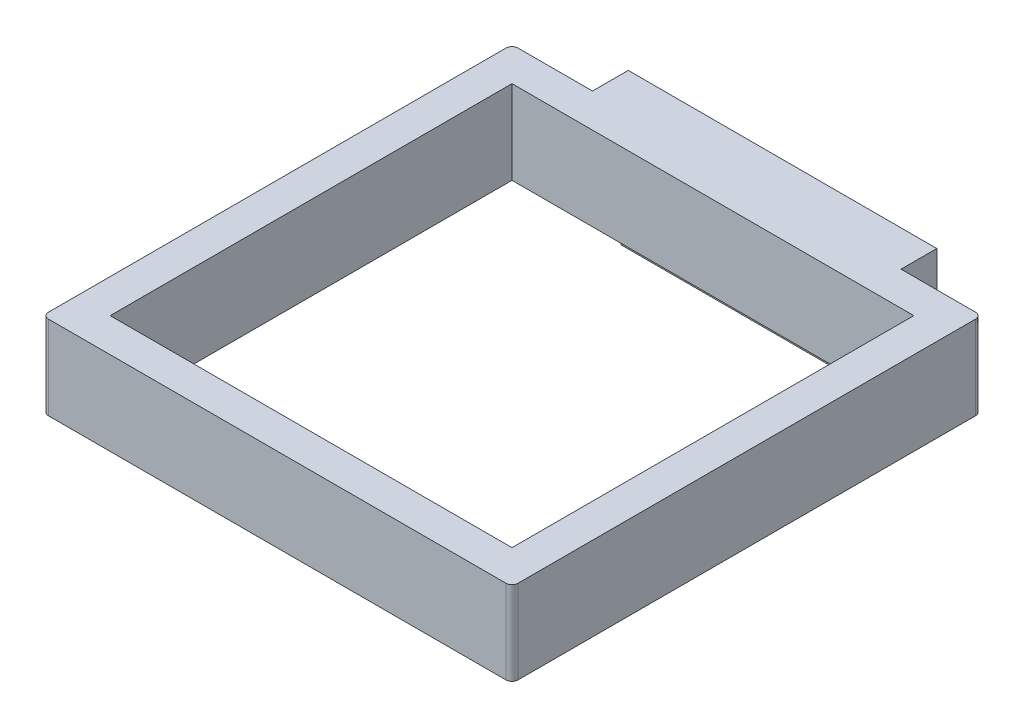
ISO-10303-21;
HEADER;
FILE_DESCRIPTION(('STEP AP214'),'2;1');
FILE_NAME('part.step','',(''),(''),'','','');
FILE_SCHEMA(('AUTOMOTIVE_DESIGN { 1 0 10303 214 1 1 1 1 }'));
ENDSEC;
DATA;
#1=APPLICATION_CONTEXT('core data for automotive mechanical design processes');
#2=APPLICATION_PROTOCOL_DEFINITION('international standard','automotive_design',2000,#1);
#3=PRODUCT_CONTEXT('',#1,'mechanical');
#4=PRODUCT('Part','Part','',(#3));
#5=PRODUCT_RELATED_PRODUCT_CATEGORY('part','',(#4));
#6=PRODUCT_DEFINITION_FORMATION('','',#4);
#7=PRODUCT_DEFINITION_CONTEXT('part definition',#1,'design');
#8=PRODUCT_DEFINITION('design','',#6,#7);
#9=PRODUCT_DEFINITION_SHAPE('','',#8);
#10=(LENGTH_UNIT() NAMED_UNIT(*) SI_UNIT(.MILLI.,.METRE.));
#11=(NAMED_UNIT(*) PLANE_ANGLE_UNIT() SI_UNIT($,.RADIAN.));
#12=(NAMED_UNIT(*) SI_UNIT($,.STERADIAN.) SOLID_ANGLE_UNIT());
#13=UNCERTAINTY_MEASURE_WITH_UNIT(LENGTH_MEASURE(1.E-05),#10,'distance_accuracy_value','');
#14=(GEOMETRIC_REPRESENTATION_CONTEXT(3) GLOBAL_UNCERTAINTY_ASSIGNED_CONTEXT((#13)) GLOBAL_UNIT_ASSIGNED_CONTEXT((#10,
#11,#12)) REPRESENTATION_CONTEXT('',''));
#15=CARTESIAN_POINT('',(0.,0.,0.));
#16=DIRECTION('',(0.,0.,1.));
#17=DIRECTION('',(1.,0.,0.));
#18=AXIS2_PLACEMENT_3D('',#15,#16,#17);
#19=CARTESIAN_POINT('',(53.9098345026567,0.,-17.1473638768007));
#20=DIRECTION('',(0.,-1.,0.));
#21=DIRECTION('',(0.,0.,-1.));
#22=AXIS2_PLACEMENT_3D('',#19,#20,#21);
#23=PLANE('',#22);
#24=DIRECTION('',(0.,0.,1.));
#25=VECTOR('',#24,1.);
#26=CARTESIAN_POINT('',(-19.3651654973433,0.,0.));
#27=LINE('',#26,#25);
#28=CARTESIAN_POINT('',(-19.3651654973433,0.,-13.6723638768007));
#29=VERTEX_POINT('',#28);
#30=CARTESIAN_POINT('',(-19.3651654973433,0.,56.1276361231993));
#31=VERTEX_POINT('',#30);
#32=EDGE_CURVE('E300',#29,#31,#27,.T.);
#33=ORIENTED_EDGE('',*,*,#32,.T.);
#34=DIRECTION('',(1.,0.,0.));
#35=VECTOR('',#34,1.);
#36=CARTESIAN_POINT('',(0.,0.,56.1276361231993));
#37=LINE('',#36,#35);
#38=CARTESIAN_POINT('',(50.4348345026567,0.,56.1276361231993));
#39=VERTEX_POINT('',#38);
#40=EDGE_CURVE('E979',#31,#39,#37,.T.);
#41=ORIENTED_EDGE('',*,*,#40,.T.);
#42=DIRECTION('',(0.,0.,-1.));
#43=VECTOR('',#42,1.);
#44=CARTESIAN_POINT('',(50.4348345026567,0.,0.));
#45=LINE('',#44,#43);
#46=CARTESIAN_POINT('',(50.4348345026567,0.,-13.6723638768007));
#47=VERTEX_POINT('',#46);
#48=EDGE_CURVE('E977',#39,#47,#45,.T.);
#49=ORIENTED_EDGE('',*,*,#48,.T.);
#50=DIRECTION('',(-1.,0.,0.));
#51=VECTOR('',#50,1.);
#52=CARTESIAN_POINT('',(0.,0.,-13.6723638768007));
#53=LINE('',#52,#51);
#54=EDGE_CURVE('E107',#47,#29,#53,.T.);
#55=ORIENTED_EDGE('',*,*,#54,.T.);
#56=EDGE_LOOP('',(#33,#41,#49,#55));
#57=FACE_BOUND('',#56,.T.);
#58=DIRECTION('',(0.,0.,-1.));
#59=VECTOR('',#58,1.);
#60=CARTESIAN_POINT('',(40.2098345026567,0.,0.));
#61=LINE('',#60,#59);
#62=CARTESIAN_POINT('',(40.2098345026567,0.,-16.9473638768007));
#63=VERTEX_POINT('',#62);
#64=CARTESIAN_POINT('',(40.2098345026567,0.,-22.9473638768007));
#65=VERTEX_POINT('',#64);
#66=EDGE_CURVE('E400',#63,#65,#61,.T.);
#67=ORIENTED_EDGE('',*,*,#66,.F.);
#68=DIRECTION('',(-1.,0.,0.));
#69=VECTOR('',#68,1.);
#70=CARTESIAN_POINT('',(0.,0.,-16.9473638768007));
#71=LINE('',#70,#69);
#72=CARTESIAN_POINT('',(53.7098345026567,0.,-16.9473638768007));
#73=VERTEX_POINT('',#72);
#74=EDGE_CURVE('E397',#73,#63,#71,.T.);
#75=ORIENTED_EDGE('',*,*,#74,.F.);
#76=DIRECTION('',(0.,0.,-1.));
#77=VECTOR('',#76,1.);
#78=CARTESIAN_POINT('',(53.7098345026567,0.,0.));
#79=LINE('',#78,#77);
#80=CARTESIAN_POINT('',(53.7098345026567,0.,59.4026361231993));
#81=VERTEX_POINT('',#80);
#82=EDGE_CURVE('E358',#81,#73,#79,.T.);
#83=ORIENTED_EDGE('',*,*,#82,.F.);
#84=DIRECTION('',(1.,0.,0.));
#85=VECTOR('',#84,1.);
#86=CARTESIAN_POINT('',(0.,0.,59.4026361231993));
#87=LINE('',#86,#85);
#88=CARTESIAN_POINT('',(-22.6401654973433,0.,59.4026361231993));
#89=VERTEX_POINT('',#88);
#90=EDGE_CURVE('E411',#89,#81,#87,.T.);
#91=ORIENTED_EDGE('',*,*,#90,.F.);
#92=DIRECTION('',(0.,0.,1.));
#93=VECTOR('',#92,1.);
#94=CARTESIAN_POINT('',(-22.6401654973433,0.,0.));
#95=LINE('',#94,#93);
#96=CARTESIAN_POINT('',(-22.6401654973433,0.,-16.9473638768007));
#97=VERTEX_POINT('',#96);
#98=EDGE_CURVE('E409',#97,#89,#95,.T.);
#99=ORIENTED_EDGE('',*,*,#98,.F.);
#100=DIRECTION('',(-1.,0.,0.));
#101=VECTOR('',#100,1.);
#102=CARTESIAN_POINT('',(0.,0.,-16.9473638768007));
#103=LINE('',#102,#101);
#104=CARTESIAN_POINT('',(-9.14016549734332,0.,-16.9473638768007));
#105=VERTEX_POINT('',#104);
#106=EDGE_CURVE('E407',#105,#97,#103,.T.);
#107=ORIENTED_EDGE('',*,*,#106,.F.);
#108=DIRECTION('',(0.,0.,1.));
#109=VECTOR('',#108,1.);
#110=CARTESIAN_POINT('',(-9.14016549734332,0.,0.));
#111=LINE('',#110,#109);
#112=CARTESIAN_POINT('',(-9.14016549734332,0.,-22.9473638768007));
#113=VERTEX_POINT('',#112);
#114=EDGE_CURVE('E405',#113,#105,#111,.T.);
#115=ORIENTED_EDGE('',*,*,#114,.F.);
#116=DIRECTION('',(-1.,0.,0.));
#117=VECTOR('',#116,1.);
#118=CARTESIAN_POINT('',(0.,0.,-22.9473638768007));
#119=LINE('',#118,#117);
#120=EDGE_CURVE('E403',#65,#113,#119,.T.);
#121=ORIENTED_EDGE('',*,*,#120,.F.);
#122=EDGE_LOOP('',(#67,#75,#83,#91,#99,#107,#115,#121));
#123=FACE_BOUND('',#122,.T.);
#124=ADVANCED_FACE('F82',(#57,#123),#23,.T.);
#125=CARTESIAN_POINT('',(53.9098345026567,1.2,-17.1473638768007));
#126=DIRECTION('',(0.,-1.,0.));
#127=DIRECTION('',(0.,0.,-1.));
#128=AXIS2_PLACEMENT_3D('',#125,#126,#127);
#129=PLANE('',#128);
#130=DIRECTION('',(0.,0.,1.));
#131=VECTOR('',#130,1.);
#132=CARTESIAN_POINT('',(-10.3401654973433,1.2,-18.1473638768007));
#133=LINE('',#132,#131);
#134=CARTESIAN_POINT('',(-10.3401654973433,1.2,-24.1473638768007));
#135=VERTEX_POINT('',#134);
#136=CARTESIAN_POINT('',(-10.3401654973433,1.2,-18.1473638768007));
#137=VERTEX_POINT('',#136);
#138=EDGE_CURVE('E445',#135,#137,#133,.T.);
#139=ORIENTED_EDGE('',*,*,#138,.T.);
#140=DIRECTION('',(-1.,0.,0.));
#141=VECTOR('',#140,1.);
#142=CARTESIAN_POINT('',(-22.8401654973433,1.2,-18.1473638768007));
#143=LINE('',#142,#141);
#144=CARTESIAN_POINT('',(-22.8401654973433,1.2,-18.1473638768007));
#145=VERTEX_POINT('',#144);
#146=EDGE_CURVE('E448',#137,#145,#143,.T.);
#147=ORIENTED_EDGE('',*,*,#146,.T.);
#148=CARTESIAN_POINT('',(-22.8401654973433,1.2,-17.1473638768007));
#149=DIRECTION('',(0.,1.,0.));
#150=DIRECTION('',(0.,0.,1.));
#151=AXIS2_PLACEMENT_3D('',#148,#149,#150);
#152=CIRCLE('',#151,1.);
#153=CARTESIAN_POINT('',(-23.8401654973433,1.2,-17.1473638768007));
#154=VERTEX_POINT('',#153);
#155=EDGE_CURVE('E450',#145,#154,#152,.T.);
#156=ORIENTED_EDGE('',*,*,#155,.T.);
#157=DIRECTION('',(0.,0.,1.));
#158=VECTOR('',#157,1.);
#159=CARTESIAN_POINT('',(-23.8401654973433,1.2,-17.1473638768007));
#160=LINE('',#159,#158);
#161=CARTESIAN_POINT('',(-23.8401654973433,1.2,59.6026361231993));
#162=VERTEX_POINT('',#161);
#163=EDGE_CURVE('E452',#154,#162,#160,.T.);
#164=ORIENTED_EDGE('',*,*,#163,.T.);
#165=CARTESIAN_POINT('',(-22.8401654973433,1.2,59.6026361231993));
#166=DIRECTION('',(0.,1.,0.));
#167=DIRECTION('',(0.,0.,-1.));
#168=AXIS2_PLACEMENT_3D('',#165,#166,#167);
#169=CIRCLE('',#168,1.);
#170=CARTESIAN_POINT('',(-22.8401654973433,1.2,60.6026361231993));
#171=VERTEX_POINT('',#170);
#172=EDGE_CURVE('E454',#162,#171,#169,.T.);
#173=ORIENTED_EDGE('',*,*,#172,.T.);
#174=DIRECTION('',(1.,0.,0.));
#175=VECTOR('',#174,1.);
#176=CARTESIAN_POINT('',(-22.8401654973433,1.2,60.6026361231993));
#177=LINE('',#176,#175);
#178=CARTESIAN_POINT('',(53.9098345026567,1.2,60.6026361231993));
#179=VERTEX_POINT('',#178);
#180=EDGE_CURVE('E456',#171,#179,#177,.T.);
#181=ORIENTED_EDGE('',*,*,#180,.T.);
#182=CARTESIAN_POINT('',(53.9098345026567,1.2,59.6026361231993));
#183=DIRECTION('',(0.,1.,0.));
#184=DIRECTION('',(0.,0.,-1.));
#185=AXIS2_PLACEMENT_3D('',#182,#183,#184);
#186=CIRCLE('',#185,1.);
#187=CARTESIAN_POINT('',(54.9098345026567,1.2,59.6026361231993));
#188=VERTEX_POINT('',#187);
#189=EDGE_CURVE('E458',#179,#188,#186,.T.);
#190=ORIENTED_EDGE('',*,*,#189,.T.);
#191=DIRECTION('',(0.,0.,-1.));
#192=VECTOR('',#191,1.);
#193=CARTESIAN_POINT('',(54.9098345026567,1.2,-17.1473638768007));
#194=LINE('',#193,#192);
#195=CARTESIAN_POINT('',(54.9098345026567,1.2,-17.1473638768007));
#196=VERTEX_POINT('',#195);
#197=EDGE_CURVE('E460',#188,#196,#194,.T.);
#198=ORIENTED_EDGE('',*,*,#197,.T.);
#199=CARTESIAN_POINT('',(53.9098345026567,1.2,-17.1473638768007));
#200=DIRECTION('',(0.,1.,0.));
#201=DIRECTION('',(0.,0.,-1.));
#202=AXIS2_PLACEMENT_3D('',#199,#200,#201);
#203=CIRCLE('',#202,1.);
#204=CARTESIAN_POINT('',(53.9098345026567,1.2,-18.1473638768007));
#205=VERTEX_POINT('',#204);
#206=EDGE_CURVE('E462',#196,#205,#203,.T.);
#207=ORIENTED_EDGE('',*,*,#206,.T.);
#208=DIRECTION('',(-1.,0.,0.));
#209=VECTOR('',#208,1.);
#210=CARTESIAN_POINT('',(41.4098345026567,1.2,-18.1473638768007));
#211=LINE('',#210,#209);
#212=CARTESIAN_POINT('',(41.4098345026567,1.2,-18.1473638768007));
#213=VERTEX_POINT('',#212);
#214=EDGE_CURVE('E464',#205,#213,#211,.T.);
#215=ORIENTED_EDGE('',*,*,#214,.T.);
#216=DIRECTION('',(0.,0.,-1.));
#217=VECTOR('',#216,1.);
#218=CARTESIAN_POINT('',(41.4098345026567,1.2,-24.1473638768007));
#219=LINE('',#218,#217);
#220=CARTESIAN_POINT('',(41.4098345026567,1.2,-24.1473638768007));
#221=VERTEX_POINT('',#220);
#222=EDGE_CURVE('E466',#213,#221,#219,.T.);
#223=ORIENTED_EDGE('',*,*,#222,.T.);
#224=DIRECTION('',(-1.,0.,0.));
#225=VECTOR('',#224,1.);
#226=CARTESIAN_POINT('',(-10.3401654973433,1.2,-24.1473638768007));
#227=LINE('',#226,#225);
#228=EDGE_CURVE('E468',#221,#135,#227,.T.);
#229=ORIENTED_EDGE('',*,*,#228,.T.);
#230=EDGE_LOOP('',(#139,#147,#156,#164,#173,#181,#190,#198,#207,#215,#223,#229));
#231=FACE_BOUND('',#230,.T.);
#232=DIRECTION('',(0.,0.,1.));
#233=VECTOR('',#232,1.);
#234=CARTESIAN_POINT('',(-18.1651654973433,1.2,-12.4723638768007));
#235=LINE('',#234,#233);
#236=CARTESIAN_POINT('',(-18.1651654973433,1.2,-12.4723638768007));
#237=VERTEX_POINT('',#236);
#238=CARTESIAN_POINT('',(-18.1651654973433,1.2,54.9276361231993));
#239=VERTEX_POINT('',#238);
#240=EDGE_CURVE('E428',#237,#239,#235,.T.);
#241=ORIENTED_EDGE('',*,*,#240,.F.);
#242=DIRECTION('',(-1.,0.,0.));
#243=VECTOR('',#242,1.);
#244=CARTESIAN_POINT('',(-18.1651654973433,1.2,-12.4723638768007));
#245=LINE('',#244,#243);
#246=CARTESIAN_POINT('',(49.2348345026567,1.2,-12.4723638768007));
#247=VERTEX_POINT('',#246);
#248=EDGE_CURVE('E435',#247,#237,#245,.T.);
#249=ORIENTED_EDGE('',*,*,#248,.F.);
#250=DIRECTION('',(0.,0.,-1.));
#251=VECTOR('',#250,1.);
#252=CARTESIAN_POINT('',(49.2348345026567,1.2,-12.4723638768007));
#253=LINE('',#252,#251);
#254=CARTESIAN_POINT('',(49.2348345026567,1.2,54.9276361231993));
#255=VERTEX_POINT('',#254);
#256=EDGE_CURVE('E432',#255,#247,#253,.T.);
#257=ORIENTED_EDGE('',*,*,#256,.F.);
#258=DIRECTION('',(1.,0.,0.));
#259=VECTOR('',#258,1.);
#260=CARTESIAN_POINT('',(-18.1651654973433,1.2,54.9276361231993));
#261=LINE('',#260,#259);
#262=EDGE_CURVE('E430',#239,#255,#261,.T.);
#263=ORIENTED_EDGE('',*,*,#262,.F.);
#264=EDGE_LOOP('',(#241,#249,#257,#263));
#265=FACE_BOUND('',#264,.T.);
#266=ADVANCED_FACE('F506',(#231,#265),#129,.F.);
#267=CARTESIAN_POINT('',(-10.3401654973433,1.2,-18.1473638768007));
#268=DIRECTION('',(1.,0.,0.));
#269=DIRECTION('',(0.,0.,-1.));
#270=AXIS2_PLACEMENT_3D('',#267,#268,#269);
#271=PLANE('',#270);
#272=DIRECTION('',(0.,-1.,0.));
#273=VECTOR('',#272,1.);
#274=CARTESIAN_POINT('',(-10.3401654973433,1.2,-24.1473638768007));
#275=LINE('',#274,#273);
#276=CARTESIAN_POINT('',(-10.3401654973433,-23.55,-24.1473638768007));
#277=VERTEX_POINT('',#276);
#278=EDGE_CURVE('E305',#135,#277,#275,.T.);
#279=ORIENTED_EDGE('',*,*,#278,.T.);
#280=DIRECTION('',(0.,0.,-1.));
#281=VECTOR('',#280,1.);
#282=CARTESIAN_POINT('',(-10.3401654973433,-23.55,-22.9473638768007));
#283=LINE('',#282,#281);
#284=CARTESIAN_POINT('',(-10.3401654973433,-23.55,-22.9473638768007));
#285=VERTEX_POINT('',#284);
#286=EDGE_CURVE('E286',#285,#277,#283,.T.);
#287=ORIENTED_EDGE('',*,*,#286,.F.);
#288=DIRECTION('',(0.,1.,0.));
#289=VECTOR('',#288,1.);
#290=CARTESIAN_POINT('',(-10.3401654973433,-23.55,-22.9473638768007));
#291=LINE('',#290,#289);
#292=CARTESIAN_POINT('',(-10.3401654973433,-12.85,-22.9473638768007));
#293=VERTEX_POINT('',#292);
#294=EDGE_CURVE('E295',#285,#293,#291,.T.);
#295=ORIENTED_EDGE('',*,*,#294,.T.);
#296=DIRECTION('',(0.,0.,-1.));
#297=VECTOR('',#296,1.);
#298=CARTESIAN_POINT('',(-10.3401654973433,-12.85,0.));
#299=LINE('',#298,#297);
#300=CARTESIAN_POINT('',(-10.3401654973433,-12.85,-18.1473638768007));
#301=VERTEX_POINT('',#300);
#302=EDGE_CURVE('E353',#301,#293,#299,.T.);
#303=ORIENTED_EDGE('',*,*,#302,.F.);
#304=DIRECTION('',(0.,-1.,0.));
#305=VECTOR('',#304,1.);
#306=CARTESIAN_POINT('',(-10.3401654973433,1.2,-18.1473638768007));
#307=LINE('',#306,#305);
#308=EDGE_CURVE('E91',#137,#301,#307,.T.);
#309=ORIENTED_EDGE('',*,*,#308,.F.);
#310=ORIENTED_EDGE('',*,*,#138,.F.);
#311=EDGE_LOOP('',(#279,#287,#295,#303,#309,#310));
#312=FACE_BOUND('',#311,.T.);
#313=ADVANCED_FACE('F84',(#312),#271,.F.);
#314=CARTESIAN_POINT('',(-22.8401654973433,1.2,-18.1473638768007));
#315=DIRECTION('',(0.,0.,1.));
#316=DIRECTION('',(1.,0.,0.));
#317=AXIS2_PLACEMENT_3D('',#314,#315,#316);
#318=PLANE('',#317);
#319=ORIENTED_EDGE('',*,*,#308,.T.);
#320=DIRECTION('',(1.,0.,0.));
#321=VECTOR('',#320,1.);
#322=CARTESIAN_POINT('',(0.,-12.85,-18.1473638768007));
#323=LINE('',#322,#321);
#324=CARTESIAN_POINT('',(-22.8401654973433,-12.85,-18.1473638768007));
#325=VERTEX_POINT('',#324);
#326=EDGE_CURVE('E356',#325,#301,#323,.T.);
#327=ORIENTED_EDGE('',*,*,#326,.F.);
#328=DIRECTION('',(0.,-1.,0.));
#329=VECTOR('',#328,1.);
#330=CARTESIAN_POINT('',(-22.8401654973433,1.2,-18.1473638768007));
#331=LINE('',#330,#329);
#332=EDGE_CURVE('E487',#145,#325,#331,.T.);
#333=ORIENTED_EDGE('',*,*,#332,.F.);
#334=ORIENTED_EDGE('',*,*,#146,.F.);
#335=EDGE_LOOP('',(#319,#327,#333,#334));
#336=FACE_BOUND('',#335,.T.);
#337=ADVANCED_FACE('F495',(#336),#318,.F.);
#338=CARTESIAN_POINT('',(-22.8401654973433,1.2,-17.1473638768007));
#339=DIRECTION('',(0.,-1.,0.));
#340=DIRECTION('',(0.,0.,-1.));
#341=AXIS2_PLACEMENT_3D('',#338,#339,#340);
#342=CYLINDRICAL_SURFACE('',#341,1.);
#343=ORIENTED_EDGE('',*,*,#332,.T.);
#344=CARTESIAN_POINT('',(-22.8401654973433,-12.85,-17.1473638768007));
#345=DIRECTION('',(0.,-1.,0.));
#346=DIRECTION('',(0.,0.,-1.));
#347=AXIS2_PLACEMENT_3D('',#344,#345,#346);
#348=CIRCLE('',#347,1.);
#349=CARTESIAN_POINT('',(-23.8401654973433,-12.85,-17.1473638768007));
#350=VERTEX_POINT('',#349);
#351=EDGE_CURVE('E384',#350,#325,#348,.T.);
#352=ORIENTED_EDGE('',*,*,#351,.F.);
#353=DIRECTION('',(0.,-1.,0.));
#354=VECTOR('',#353,1.);
#355=CARTESIAN_POINT('',(-23.8401654973433,1.2,-17.1473638768007));
#356=LINE('',#355,#354);
#357=EDGE_CURVE('E486',#154,#350,#356,.T.);
#358=ORIENTED_EDGE('',*,*,#357,.F.);
#359=ORIENTED_EDGE('',*,*,#155,.F.);
#360=EDGE_LOOP('',(#343,#352,#358,#359));
#361=FACE_BOUND('',#360,.T.);
#362=ADVANCED_FACE('F499',(#361),#342,.T.);
#363=CARTESIAN_POINT('',(-23.8401654973433,1.2,-17.1473638768007));
#364=DIRECTION('',(1.,0.,0.));
#365=DIRECTION('',(0.,0.,-1.));
#366=AXIS2_PLACEMENT_3D('',#363,#364,#365);
#367=PLANE('',#366);
#368=ORIENTED_EDGE('',*,*,#357,.T.);
#369=DIRECTION('',(0.,0.,-1.));
#370=VECTOR('',#369,1.);
#371=CARTESIAN_POINT('',(-23.8401654973433,-12.85,0.));
#372=LINE('',#371,#370);
#373=CARTESIAN_POINT('',(-23.8401654973433,-12.85,59.6026361231993));
#374=VERTEX_POINT('',#373);
#375=EDGE_CURVE('E381',#374,#350,#372,.T.);
#376=ORIENTED_EDGE('',*,*,#375,.F.);
#377=DIRECTION('',(0.,-1.,0.));
#378=VECTOR('',#377,1.);
#379=CARTESIAN_POINT('',(-23.8401654973433,1.2,59.6026361231993));
#380=LINE('',#379,#378);
#381=EDGE_CURVE('E484',#162,#374,#380,.T.);
#382=ORIENTED_EDGE('',*,*,#381,.F.);
#383=ORIENTED_EDGE('',*,*,#163,.F.);
#384=EDGE_LOOP('',(#368,#376,#382,#383));
#385=FACE_BOUND('',#384,.T.);
#386=ADVANCED_FACE('F503',(#385),#367,.F.);
#387=CARTESIAN_POINT('',(-22.8401654973433,1.2,59.6026361231993));
#388=DIRECTION('',(0.,-1.,0.));
#389=DIRECTION('',(0.,0.,-1.));
#390=AXIS2_PLACEMENT_3D('',#387,#388,#389);
#391=CYLINDRICAL_SURFACE('',#390,1.);
#392=ORIENTED_EDGE('',*,*,#381,.T.);
#393=CARTESIAN_POINT('',(-22.8401654973433,-12.85,59.6026361231993));
#394=DIRECTION('',(0.,-1.,0.));
#395=DIRECTION('',(0.,0.,-1.));
#396=AXIS2_PLACEMENT_3D('',#393,#394,#395);
#397=CIRCLE('',#396,1.);
#398=CARTESIAN_POINT('',(-22.8401654973433,-12.85,60.6026361231993));
#399=VERTEX_POINT('',#398);
#400=EDGE_CURVE('E378',#399,#374,#397,.T.);
#401=ORIENTED_EDGE('',*,*,#400,.F.);
#402=DIRECTION('',(0.,-1.,0.));
#403=VECTOR('',#402,1.);
#404=CARTESIAN_POINT('',(-22.8401654973433,1.2,60.6026361231993));
#405=LINE('',#404,#403);
#406=EDGE_CURVE('E482',#171,#399,#405,.T.);
#407=ORIENTED_EDGE('',*,*,#406,.F.);
#408=ORIENTED_EDGE('',*,*,#172,.F.);
#409=EDGE_LOOP('',(#392,#401,#407,#408));
#410=FACE_BOUND('',#409,.T.);
#411=ADVANCED_FACE('F727',(#410),#391,.T.);
#412=CARTESIAN_POINT('',(-22.8401654973433,1.2,60.6026361231993));
#413=DIRECTION('',(0.,0.,-1.));
#414=DIRECTION('',(-1.,0.,0.));
#415=AXIS2_PLACEMENT_3D('',#412,#413,#414);
#416=PLANE('',#415);
#417=ORIENTED_EDGE('',*,*,#406,.T.);
#418=DIRECTION('',(-1.,0.,0.));
#419=VECTOR('',#418,1.);
#420=CARTESIAN_POINT('',(0.,-12.85,60.6026361231993));
#421=LINE('',#420,#419);
#422=CARTESIAN_POINT('',(53.9098345026567,-12.85,60.6026361231993));
#423=VERTEX_POINT('',#422);
#424=EDGE_CURVE('E375',#423,#399,#421,.T.);
#425=ORIENTED_EDGE('',*,*,#424,.F.);
#426=DIRECTION('',(0.,-1.,0.));
#427=VECTOR('',#426,1.);
#428=CARTESIAN_POINT('',(53.9098345026567,1.2,60.6026361231993));
#429=LINE('',#428,#427);
#430=EDGE_CURVE('E480',#179,#423,#429,.T.);
#431=ORIENTED_EDGE('',*,*,#430,.F.);
#432=ORIENTED_EDGE('',*,*,#180,.F.);
#433=EDGE_LOOP('',(#417,#425,#431,#432));
#434=FACE_BOUND('',#433,.T.);
#435=ADVANCED_FACE('F716',(#434),#416,.F.);
#436=CARTESIAN_POINT('',(53.9098345026567,1.2,59.6026361231993));
#437=DIRECTION('',(0.,-1.,0.));
#438=DIRECTION('',(0.,0.,-1.));
#439=AXIS2_PLACEMENT_3D('',#436,#437,#438);
#440=CYLINDRICAL_SURFACE('',#439,1.);
#441=ORIENTED_EDGE('',*,*,#430,.T.);
#442=CARTESIAN_POINT('',(53.9098345026567,-12.85,59.6026361231993));
#443=DIRECTION('',(0.,-1.,0.));
#444=DIRECTION('',(0.,0.,-1.));
#445=AXIS2_PLACEMENT_3D('',#442,#443,#444);
#446=CIRCLE('',#445,1.);
#447=CARTESIAN_POINT('',(54.9098345026567,-12.85,59.6026361231993));
#448=VERTEX_POINT('',#447);
#449=EDGE_CURVE('E372',#448,#423,#446,.T.);
#450=ORIENTED_EDGE('',*,*,#449,.F.);
#451=DIRECTION('',(0.,-1.,0.));
#452=VECTOR('',#451,1.);
#453=CARTESIAN_POINT('',(54.9098345026567,1.2,59.6026361231993));
#454=LINE('',#453,#452);
#455=EDGE_CURVE('E478',#188,#448,#454,.T.);
#456=ORIENTED_EDGE('',*,*,#455,.F.);
#457=ORIENTED_EDGE('',*,*,#189,.F.);
#458=EDGE_LOOP('',(#441,#450,#456,#457));
#459=FACE_BOUND('',#458,.T.);
#460=ADVANCED_FACE('F705',(#459),#440,.T.);
#461=CARTESIAN_POINT('',(54.9098345026567,1.2,-17.1473638768007));
#462=DIRECTION('',(-1.,0.,0.));
#463=DIRECTION('',(0.,0.,1.));
#464=AXIS2_PLACEMENT_3D('',#461,#462,#463);
#465=PLANE('',#464);
#466=ORIENTED_EDGE('',*,*,#455,.T.);
#467=DIRECTION('',(0.,0.,1.));
#468=VECTOR('',#467,1.);
#469=CARTESIAN_POINT('',(54.9098345026567,-12.85,0.));
#470=LINE('',#469,#468);
#471=CARTESIAN_POINT('',(54.9098345026567,-12.85,-17.1473638768007));
#472=VERTEX_POINT('',#471);
#473=EDGE_CURVE('E369',#472,#448,#470,.T.);
#474=ORIENTED_EDGE('',*,*,#473,.F.);
#475=DIRECTION('',(0.,-1.,0.));
#476=VECTOR('',#475,1.);
#477=CARTESIAN_POINT('',(54.9098345026567,1.2,-17.1473638768007));
#478=LINE('',#477,#476);
#479=EDGE_CURVE('E476',#196,#472,#478,.T.);
#480=ORIENTED_EDGE('',*,*,#479,.F.);
#481=ORIENTED_EDGE('',*,*,#197,.F.);
#482=EDGE_LOOP('',(#466,#474,#480,#481));
#483=FACE_BOUND('',#482,.T.);
#484=ADVANCED_FACE('F694',(#483),#465,.F.);
#485=CARTESIAN_POINT('',(53.9098345026567,1.2,-17.1473638768007));
#486=DIRECTION('',(0.,-1.,0.));
#487=DIRECTION('',(0.,0.,-1.));
#488=AXIS2_PLACEMENT_3D('',#485,#486,#487);
#489=CYLINDRICAL_SURFACE('',#488,1.);
#490=ORIENTED_EDGE('',*,*,#479,.T.);
#491=CARTESIAN_POINT('',(53.9098345026567,-12.85,-17.1473638768007));
#492=DIRECTION('',(0.,-1.,0.));
#493=DIRECTION('',(0.,0.,-1.));
#494=AXIS2_PLACEMENT_3D('',#491,#492,#493);
#495=CIRCLE('',#494,1.);
#496=CARTESIAN_POINT('',(53.9098345026567,-12.85,-18.1473638768007));
#497=VERTEX_POINT('',#496);
#498=EDGE_CURVE('E354',#497,#472,#495,.T.);
#499=ORIENTED_EDGE('',*,*,#498,.F.);
#500=DIRECTION('',(0.,-1.,0.));
#501=VECTOR('',#500,1.);
#502=CARTESIAN_POINT('',(53.9098345026567,1.2,-18.1473638768007));
#503=LINE('',#502,#501);
#504=EDGE_CURVE('E474',#205,#497,#503,.T.);
#505=ORIENTED_EDGE('',*,*,#504,.F.);
#506=ORIENTED_EDGE('',*,*,#206,.F.);
#507=EDGE_LOOP('',(#490,#499,#505,#506));
#508=FACE_BOUND('',#507,.T.);
#509=ADVANCED_FACE('F682',(#508),#489,.T.);
#510=CARTESIAN_POINT('',(41.4098345026567,1.2,-18.1473638768007));
#511=DIRECTION('',(0.,0.,1.));
#512=DIRECTION('',(1.,0.,0.));
#513=AXIS2_PLACEMENT_3D('',#510,#511,#512);
#514=PLANE('',#513);
#515=ORIENTED_EDGE('',*,*,#504,.T.);
#516=DIRECTION('',(1.,0.,0.));
#517=VECTOR('',#516,1.);
#518=CARTESIAN_POINT('',(0.,-12.85,-18.1473638768007));
#519=LINE('',#518,#517);
#520=CARTESIAN_POINT('',(41.4098345026567,-12.85,-18.1473638768007));
#521=VERTEX_POINT('',#520);
#522=EDGE_CURVE('E352',#521,#497,#519,.T.);
#523=ORIENTED_EDGE('',*,*,#522,.F.);
#524=DIRECTION('',(0.,-1.,0.));
#525=VECTOR('',#524,1.);
#526=CARTESIAN_POINT('',(41.4098345026567,1.2,-18.1473638768007));
#527=LINE('',#526,#525);
#528=EDGE_CURVE('E349',#213,#521,#527,.T.);
#529=ORIENTED_EDGE('',*,*,#528,.F.);
#530=ORIENTED_EDGE('',*,*,#214,.F.);
#531=EDGE_LOOP('',(#515,#523,#529,#530));
#532=FACE_BOUND('',#531,.T.);
#533=ADVANCED_FACE('F522',(#532),#514,.F.);
#534=CARTESIAN_POINT('',(41.4098345026567,1.2,-24.1473638768007));
#535=DIRECTION('',(-1.,0.,0.));
#536=DIRECTION('',(0.,0.,1.));
#537=AXIS2_PLACEMENT_3D('',#534,#535,#536);
#538=PLANE('',#537);
#539=ORIENTED_EDGE('',*,*,#528,.T.);
#540=DIRECTION('',(0.,0.,1.));
#541=VECTOR('',#540,1.);
#542=CARTESIAN_POINT('',(41.4098345026567,-12.85,0.));
#543=LINE('',#542,#541);
#544=CARTESIAN_POINT('',(41.4098345026567,-12.85,-22.9473638768007));
#545=VERTEX_POINT('',#544);
#546=EDGE_CURVE('E316',#545,#521,#543,.T.);
#547=ORIENTED_EDGE('',*,*,#546,.F.);
#548=DIRECTION('',(0.,1.,0.));
#549=VECTOR('',#548,1.);
#550=CARTESIAN_POINT('',(41.4098345026567,-23.55,-22.9473638768007));
#551=LINE('',#550,#549);
#552=CARTESIAN_POINT('',(41.4098345026567,-23.55,-22.9473638768007));
#553=VERTEX_POINT('',#552);
#554=EDGE_CURVE('E301',#553,#545,#551,.T.);
#555=ORIENTED_EDGE('',*,*,#554,.F.);
#556=DIRECTION('',(0.,0.,1.));
#557=VECTOR('',#556,1.);
#558=CARTESIAN_POINT('',(41.4098345026567,-23.55,-24.1473638768007));
#559=LINE('',#558,#557);
#560=CARTESIAN_POINT('',(41.4098345026567,-23.55,-24.1473638768007));
#561=VERTEX_POINT('',#560);
#562=EDGE_CURVE('E289',#561,#553,#559,.T.);
#563=ORIENTED_EDGE('',*,*,#562,.F.);
#564=DIRECTION('',(0.,-1.,0.));
#565=VECTOR('',#564,1.);
#566=CARTESIAN_POINT('',(41.4098345026567,1.2,-24.1473638768007));
#567=LINE('',#566,#565);
#568=EDGE_CURVE('E471',#221,#561,#567,.T.);
#569=ORIENTED_EDGE('',*,*,#568,.F.);
#570=ORIENTED_EDGE('',*,*,#222,.F.);
#571=EDGE_LOOP('',(#539,#547,#555,#563,#569,#570));
#572=FACE_BOUND('',#571,.T.);
#573=ADVANCED_FACE('F345',(#572),#538,.F.);
#574=CARTESIAN_POINT('',(-10.3401654973433,1.2,-24.1473638768007));
#575=DIRECTION('',(0.,0.,1.));
#576=DIRECTION('',(1.,0.,0.));
#577=AXIS2_PLACEMENT_3D('',#574,#575,#576);
#578=PLANE('',#577);
#579=ORIENTED_EDGE('',*,*,#568,.T.);
#580=DIRECTION('',(1.,0.,0.));
#581=VECTOR('',#580,1.);
#582=CARTESIAN_POINT('',(-10.3401654973433,-23.55,-24.1473638768007));
#583=LINE('',#582,#581);
#584=EDGE_CURVE('E306',#277,#561,#583,.T.);
#585=ORIENTED_EDGE('',*,*,#584,.F.);
#586=ORIENTED_EDGE('',*,*,#278,.F.);
#587=ORIENTED_EDGE('',*,*,#228,.F.);
#588=EDGE_LOOP('',(#579,#585,#586,#587));
#589=FACE_BOUND('',#588,.T.);
#590=ADVANCED_FACE('F511',(#589),#578,.F.);
#591=CARTESIAN_POINT('',(-18.1651654973433,1.2,-12.4723638768007));
#592=DIRECTION('',(1.,0.,0.));
#593=DIRECTION('',(0.,0.,-1.));
#594=AXIS2_PLACEMENT_3D('',#591,#592,#593);
#595=PLANE('',#594);
#596=DIRECTION('',(0.,-1.,0.));
#597=VECTOR('',#596,1.);
#598=CARTESIAN_POINT('',(-18.1651654973433,1.2,54.9276361231993));
#599=LINE('',#598,#597);
#600=CARTESIAN_POINT('',(-18.1651654973433,-12.85,54.9276361231993));
#601=VERTEX_POINT('',#600);
#602=EDGE_CURVE('E443',#239,#601,#599,.T.);
#603=ORIENTED_EDGE('',*,*,#602,.T.);
#604=DIRECTION('',(0.,0.,1.));
#605=VECTOR('',#604,1.);
#606=CARTESIAN_POINT('',(-18.1651654973433,-12.85,0.));
#607=LINE('',#606,#605);
#608=CARTESIAN_POINT('',(-18.1651654973433,-12.85,-12.4723638768007));
#609=VERTEX_POINT('',#608);
#610=EDGE_CURVE('E965',#609,#601,#607,.T.);
#611=ORIENTED_EDGE('',*,*,#610,.F.);
#612=DIRECTION('',(0.,-1.,0.));
#613=VECTOR('',#612,1.);
#614=CARTESIAN_POINT('',(-18.1651654973433,1.2,-12.4723638768007));
#615=LINE('',#614,#613);
#616=EDGE_CURVE('E437',#237,#609,#615,.T.);
#617=ORIENTED_EDGE('',*,*,#616,.F.);
#618=ORIENTED_EDGE('',*,*,#240,.T.);
#619=EDGE_LOOP('',(#603,#611,#617,#618));
#620=FACE_BOUND('',#619,.T.);
#621=ADVANCED_FACE('F513',(#620),#595,.T.);
#622=CARTESIAN_POINT('',(-18.1651654973433,1.2,54.9276361231993));
#623=DIRECTION('',(0.,0.,-1.));
#624=DIRECTION('',(-1.,0.,0.));
#625=AXIS2_PLACEMENT_3D('',#622,#623,#624);
#626=PLANE('',#625);
#627=DIRECTION('',(0.,-1.,0.));
#628=VECTOR('',#627,1.);
#629=CARTESIAN_POINT('',(49.2348345026567,1.2,54.9276361231993));
#630=LINE('',#629,#628);
#631=CARTESIAN_POINT('',(49.2348345026567,-12.85,54.9276361231993));
#632=VERTEX_POINT('',#631);
#633=EDGE_CURVE('E441',#255,#632,#630,.T.);
#634=ORIENTED_EDGE('',*,*,#633,.T.);
#635=DIRECTION('',(1.,0.,0.));
#636=VECTOR('',#635,1.);
#637=CARTESIAN_POINT('',(0.,-12.85,54.9276361231993));
#638=LINE('',#637,#636);
#639=EDGE_CURVE('E961',#601,#632,#638,.T.);
#640=ORIENTED_EDGE('',*,*,#639,.F.);
#641=ORIENTED_EDGE('',*,*,#602,.F.);
#642=ORIENTED_EDGE('',*,*,#262,.T.);
#643=EDGE_LOOP('',(#634,#640,#641,#642));
#644=FACE_BOUND('',#643,.T.);
#645=ADVANCED_FACE('F519',(#644),#626,.T.);
#646=CARTESIAN_POINT('',(49.2348345026567,1.2,-12.4723638768007));
#647=DIRECTION('',(-1.,0.,0.));
#648=DIRECTION('',(0.,0.,1.));
#649=AXIS2_PLACEMENT_3D('',#646,#647,#648);
#650=PLANE('',#649);
#651=DIRECTION('',(0.,-1.,0.));
#652=VECTOR('',#651,1.);
#653=CARTESIAN_POINT('',(49.2348345026567,1.2,-12.4723638768007));
#654=LINE('',#653,#652);
#655=CARTESIAN_POINT('',(49.2348345026567,-12.85,-12.4723638768007));
#656=VERTEX_POINT('',#655);
#657=EDGE_CURVE('E439',#247,#656,#654,.T.);
#658=ORIENTED_EDGE('',*,*,#657,.T.);
#659=DIRECTION('',(0.,0.,-1.));
#660=VECTOR('',#659,1.);
#661=CARTESIAN_POINT('',(49.2348345026567,-12.85,0.));
#662=LINE('',#661,#660);
#663=EDGE_CURVE('E955',#632,#656,#662,.T.);
#664=ORIENTED_EDGE('',*,*,#663,.F.);
#665=ORIENTED_EDGE('',*,*,#633,.F.);
#666=ORIENTED_EDGE('',*,*,#256,.T.);
#667=EDGE_LOOP('',(#658,#664,#665,#666));
#668=FACE_BOUND('',#667,.T.);
#669=ADVANCED_FACE('F534',(#668),#650,.T.);
#670=CARTESIAN_POINT('',(-18.1651654973433,1.2,-12.4723638768007));
#671=DIRECTION('',(0.,0.,1.));
#672=DIRECTION('',(1.,0.,0.));
#673=AXIS2_PLACEMENT_3D('',#670,#671,#672);
#674=PLANE('',#673);
#675=ORIENTED_EDGE('',*,*,#616,.T.);
#676=DIRECTION('',(-1.,0.,0.));
#677=VECTOR('',#676,1.);
#678=CARTESIAN_POINT('',(0.,-12.85,-12.4723638768007));
#679=LINE('',#678,#677);
#680=EDGE_CURVE('E958',#656,#609,#679,.T.);
#681=ORIENTED_EDGE('',*,*,#680,.F.);
#682=ORIENTED_EDGE('',*,*,#657,.F.);
#683=ORIENTED_EDGE('',*,*,#248,.T.);
#684=EDGE_LOOP('',(#675,#681,#682,#683));
#685=FACE_BOUND('',#684,.T.);
#686=ADVANCED_FACE('F538',(#685),#674,.T.);
#687=CARTESIAN_POINT('',(0.,-12.85,-16.9473638768007));
#688=DIRECTION('',(0.,0.,-1.));
#689=DIRECTION('',(-1.,0.,0.));
#690=AXIS2_PLACEMENT_3D('',#687,#688,#689);
#691=PLANE('',#690);
#692=ORIENTED_EDGE('',*,*,#74,.T.);
#693=DIRECTION('',(0.,1.,0.));
#694=VECTOR('',#693,1.);
#695=CARTESIAN_POINT('',(40.2098345026567,-12.85,-16.9473638768007));
#696=LINE('',#695,#694);
#697=CARTESIAN_POINT('',(40.2098345026567,-12.85,-16.9473638768007));
#698=VERTEX_POINT('',#697);
#699=EDGE_CURVE('E341',#698,#63,#696,.T.);
#700=ORIENTED_EDGE('',*,*,#699,.F.);
#701=DIRECTION('',(-1.,0.,0.));
#702=VECTOR('',#701,1.);
#703=CARTESIAN_POINT('',(0.,-12.85,-16.9473638768007));
#704=LINE('',#703,#702);
#705=CARTESIAN_POINT('',(53.7098345026567,-12.85,-16.9473638768007));
#706=VERTEX_POINT('',#705);
#707=EDGE_CURVE('E336',#706,#698,#704,.T.);
#708=ORIENTED_EDGE('',*,*,#707,.F.);
#709=DIRECTION('',(0.,1.,0.));
#710=VECTOR('',#709,1.);
#711=CARTESIAN_POINT('',(53.7098345026567,-12.85,-16.9473638768007));
#712=LINE('',#711,#710);
#713=EDGE_CURVE('E396',#706,#73,#712,.T.);
#714=ORIENTED_EDGE('',*,*,#713,.T.);
#715=EDGE_LOOP('',(#692,#700,#708,#714));
#716=FACE_BOUND('',#715,.T.);
#717=ADVANCED_FACE('F542',(#716),#691,.F.);
#718=CARTESIAN_POINT('',(40.2098345026567,-12.85,0.));
#719=DIRECTION('',(1.,0.,0.));
#720=DIRECTION('',(0.,0.,-1.));
#721=AXIS2_PLACEMENT_3D('',#718,#719,#720);
#722=PLANE('',#721);
#723=ORIENTED_EDGE('',*,*,#66,.T.);
#724=DIRECTION('',(0.,1.,0.));
#725=VECTOR('',#724,1.);
#726=CARTESIAN_POINT('',(40.2098345026567,-12.85,-22.9473638768007));
#727=LINE('',#726,#725);
#728=CARTESIAN_POINT('',(40.2098345026567,-12.85,-22.9473638768007));
#729=VERTEX_POINT('',#728);
#730=EDGE_CURVE('E325',#729,#65,#727,.T.);
#731=ORIENTED_EDGE('',*,*,#730,.F.);
#732=DIRECTION('',(0.,0.,-1.));
#733=VECTOR('',#732,1.);
#734=CARTESIAN_POINT('',(40.2098345026567,-12.85,0.));
#735=LINE('',#734,#733);
#736=EDGE_CURVE('E332',#698,#729,#735,.T.);
#737=ORIENTED_EDGE('',*,*,#736,.F.);
#738=ORIENTED_EDGE('',*,*,#699,.T.);
#739=EDGE_LOOP('',(#723,#731,#737,#738));
#740=FACE_BOUND('',#739,.T.);
#741=ADVANCED_FACE('F546',(#740),#722,.F.);
#742=CARTESIAN_POINT('',(0.,-12.85,-22.9473638768007));
#743=DIRECTION('',(0.,0.,-1.));
#744=DIRECTION('',(-1.,0.,0.));
#745=AXIS2_PLACEMENT_3D('',#742,#743,#744);
#746=PLANE('',#745);
#747=ORIENTED_EDGE('',*,*,#120,.T.);
#748=DIRECTION('',(0.,1.,0.));
#749=VECTOR('',#748,1.);
#750=CARTESIAN_POINT('',(-9.14016549734332,-12.85,-22.9473638768007));
#751=LINE('',#750,#749);
#752=CARTESIAN_POINT('',(-9.14016549734332,-12.85,-22.9473638768007));
#753=VERTEX_POINT('',#752);
#754=EDGE_CURVE('E322',#753,#113,#751,.T.);
#755=ORIENTED_EDGE('',*,*,#754,.F.);
#756=DIRECTION('',(-1.,0.,0.));
#757=VECTOR('',#756,1.);
#758=CARTESIAN_POINT('',(-9.14016549734332,-12.85,-22.9473638768007));
#759=LINE('',#758,#757);
#760=EDGE_CURVE('E12',#753,#293,#759,.T.);
#761=ORIENTED_EDGE('',*,*,#760,.T.);
#762=ORIENTED_EDGE('',*,*,#294,.F.);
#763=DIRECTION('',(-1.,0.,0.));
#764=VECTOR('',#763,1.);
#765=CARTESIAN_POINT('',(41.4098345026567,-23.55,-22.9473638768007));
#766=LINE('',#765,#764);
#767=EDGE_CURVE('E281',#553,#285,#766,.T.);
#768=ORIENTED_EDGE('',*,*,#767,.F.);
#769=ORIENTED_EDGE('',*,*,#554,.T.);
#770=EDGE_CURVE('E99',#545,#729,#759,.T.);
#771=ORIENTED_EDGE('',*,*,#770,.T.);
#772=ORIENTED_EDGE('',*,*,#730,.T.);
#773=EDGE_LOOP('',(#747,#755,#761,#762,#768,#769,#771,#772));
#774=FACE_BOUND('',#773,.T.);
#775=ADVANCED_FACE('F296',(#774),#746,.F.);
#776=CARTESIAN_POINT('',(-9.14016549734332,-12.85,0.));
#777=DIRECTION('',(-1.,0.,0.));
#778=DIRECTION('',(0.,0.,1.));
#779=AXIS2_PLACEMENT_3D('',#776,#777,#778);
#780=PLANE('',#779);
#781=ORIENTED_EDGE('',*,*,#114,.T.);
#782=DIRECTION('',(0.,1.,0.));
#783=VECTOR('',#782,1.);
#784=CARTESIAN_POINT('',(-9.14016549734332,-12.85,-16.9473638768007));
#785=LINE('',#784,#783);
#786=CARTESIAN_POINT('',(-9.14016549734332,-12.85,-16.9473638768007));
#787=VERTEX_POINT('',#786);
#788=EDGE_CURVE('E326',#787,#105,#785,.T.);
#789=ORIENTED_EDGE('',*,*,#788,.F.);
#790=DIRECTION('',(0.,0.,1.));
#791=VECTOR('',#790,1.);
#792=CARTESIAN_POINT('',(-9.14016549734332,-12.85,0.));
#793=LINE('',#792,#791);
#794=EDGE_CURVE('E329',#753,#787,#793,.T.);
#795=ORIENTED_EDGE('',*,*,#794,.F.);
#796=ORIENTED_EDGE('',*,*,#754,.T.);
#797=EDGE_LOOP('',(#781,#789,#795,#796));
#798=FACE_BOUND('',#797,.T.);
#799=ADVANCED_FACE('F553',(#798),#780,.F.);
#800=CARTESIAN_POINT('',(0.,-12.85,-16.9473638768007));
#801=DIRECTION('',(0.,0.,-1.));
#802=DIRECTION('',(-1.,0.,0.));
#803=AXIS2_PLACEMENT_3D('',#800,#801,#802);
#804=PLANE('',#803);
#805=ORIENTED_EDGE('',*,*,#106,.T.);
#806=DIRECTION('',(0.,1.,0.));
#807=VECTOR('',#806,1.);
#808=CARTESIAN_POINT('',(-22.6401654973433,-12.85,-16.9473638768007));
#809=LINE('',#808,#807);
#810=CARTESIAN_POINT('',(-22.6401654973433,-12.85,-16.9473638768007));
#811=VERTEX_POINT('',#810);
#812=EDGE_CURVE('E422',#811,#97,#809,.T.);
#813=ORIENTED_EDGE('',*,*,#812,.F.);
#814=DIRECTION('',(-1.,0.,0.));
#815=VECTOR('',#814,1.);
#816=CARTESIAN_POINT('',(0.,-12.85,-16.9473638768007));
#817=LINE('',#816,#815);
#818=EDGE_CURVE('E331',#787,#811,#817,.T.);
#819=ORIENTED_EDGE('',*,*,#818,.F.);
#820=ORIENTED_EDGE('',*,*,#788,.T.);
#821=EDGE_LOOP('',(#805,#813,#819,#820));
#822=FACE_BOUND('',#821,.T.);
#823=ADVANCED_FACE('F556',(#822),#804,.F.);
#824=CARTESIAN_POINT('',(-22.6401654973433,-12.85,0.));
#825=DIRECTION('',(-1.,0.,0.));
#826=DIRECTION('',(0.,0.,1.));
#827=AXIS2_PLACEMENT_3D('',#824,#825,#826);
#828=PLANE('',#827);
#829=ORIENTED_EDGE('',*,*,#98,.T.);
#830=DIRECTION('',(0.,1.,0.));
#831=VECTOR('',#830,1.);
#832=CARTESIAN_POINT('',(-22.6401654973433,-12.85,59.4026361231993));
#833=LINE('',#832,#831);
#834=CARTESIAN_POINT('',(-22.6401654973433,-12.85,59.4026361231993));
#835=VERTEX_POINT('',#834);
#836=EDGE_CURVE('E419',#835,#89,#833,.T.);
#837=ORIENTED_EDGE('',*,*,#836,.F.);
#838=DIRECTION('',(0.,0.,1.));
#839=VECTOR('',#838,1.);
#840=CARTESIAN_POINT('',(-22.6401654973433,-12.85,0.));
#841=LINE('',#840,#839);
#842=EDGE_CURVE('E390',#811,#835,#841,.T.);
#843=ORIENTED_EDGE('',*,*,#842,.F.);
#844=ORIENTED_EDGE('',*,*,#812,.T.);
#845=EDGE_LOOP('',(#829,#837,#843,#844));
#846=FACE_BOUND('',#845,.T.);
#847=ADVANCED_FACE('F560',(#846),#828,.F.);
#848=CARTESIAN_POINT('',(0.,-12.85,59.4026361231993));
#849=DIRECTION('',(0.,0.,1.));
#850=DIRECTION('',(1.,0.,0.));
#851=AXIS2_PLACEMENT_3D('',#848,#849,#850);
#852=PLANE('',#851);
#853=ORIENTED_EDGE('',*,*,#90,.T.);
#854=DIRECTION('',(0.,1.,0.));
#855=VECTOR('',#854,1.);
#856=CARTESIAN_POINT('',(53.7098345026567,-12.85,59.4026361231993));
#857=LINE('',#856,#855);
#858=CARTESIAN_POINT('',(53.7098345026567,-12.85,59.4026361231993));
#859=VERTEX_POINT('',#858);
#860=EDGE_CURVE('E417',#859,#81,#857,.T.);
#861=ORIENTED_EDGE('',*,*,#860,.F.);
#862=DIRECTION('',(1.,0.,0.));
#863=VECTOR('',#862,1.);
#864=CARTESIAN_POINT('',(0.,-12.85,59.4026361231993));
#865=LINE('',#864,#863);
#866=EDGE_CURVE('E392',#835,#859,#865,.T.);
#867=ORIENTED_EDGE('',*,*,#866,.F.);
#868=ORIENTED_EDGE('',*,*,#836,.T.);
#869=EDGE_LOOP('',(#853,#861,#867,#868));
#870=FACE_BOUND('',#869,.T.);
#871=ADVANCED_FACE('F564',(#870),#852,.F.);
#872=CARTESIAN_POINT('',(53.7098345026567,-12.85,0.));
#873=DIRECTION('',(1.,0.,0.));
#874=DIRECTION('',(0.,0.,-1.));
#875=AXIS2_PLACEMENT_3D('',#872,#873,#874);
#876=PLANE('',#875);
#877=ORIENTED_EDGE('',*,*,#82,.T.);
#878=ORIENTED_EDGE('',*,*,#713,.F.);
#879=DIRECTION('',(0.,0.,-1.));
#880=VECTOR('',#879,1.);
#881=CARTESIAN_POINT('',(53.7098345026567,-12.85,0.));
#882=LINE('',#881,#880);
#883=EDGE_CURVE('E394',#859,#706,#882,.T.);
#884=ORIENTED_EDGE('',*,*,#883,.F.);
#885=ORIENTED_EDGE('',*,*,#860,.T.);
#886=EDGE_LOOP('',(#877,#878,#884,#885));
#887=FACE_BOUND('',#886,.T.);
#888=ADVANCED_FACE('F568',(#887),#876,.F.);
#889=CARTESIAN_POINT('',(0.,-12.85,0.));
#890=DIRECTION('',(0.,-1.,0.));
#891=DIRECTION('',(0.,0.,-1.));
#892=AXIS2_PLACEMENT_3D('',#889,#890,#891);
#893=PLANE('',#892);
#894=ORIENTED_EDGE('',*,*,#770,.F.);
#895=ORIENTED_EDGE('',*,*,#546,.T.);
#896=ORIENTED_EDGE('',*,*,#522,.T.);
#897=ORIENTED_EDGE('',*,*,#498,.T.);
#898=ORIENTED_EDGE('',*,*,#473,.T.);
#899=ORIENTED_EDGE('',*,*,#449,.T.);
#900=ORIENTED_EDGE('',*,*,#424,.T.);
#901=ORIENTED_EDGE('',*,*,#400,.T.);
#902=ORIENTED_EDGE('',*,*,#375,.T.);
#903=ORIENTED_EDGE('',*,*,#351,.T.);
#904=ORIENTED_EDGE('',*,*,#326,.T.);
#905=ORIENTED_EDGE('',*,*,#302,.T.);
#906=ORIENTED_EDGE('',*,*,#760,.F.);
#907=ORIENTED_EDGE('',*,*,#794,.T.);
#908=ORIENTED_EDGE('',*,*,#818,.T.);
#909=ORIENTED_EDGE('',*,*,#842,.T.);
#910=ORIENTED_EDGE('',*,*,#866,.T.);
#911=ORIENTED_EDGE('',*,*,#883,.T.);
#912=ORIENTED_EDGE('',*,*,#707,.T.);
#913=ORIENTED_EDGE('',*,*,#736,.T.);
#914=EDGE_LOOP('',(#894,#895,#896,#897,#898,#899,#900,#901,#902,#903,#904,#905,#906,#907,#908,
#909,#910,#911,#912,#913));
#915=FACE_BOUND('',#914,.T.);
#916=ADVANCED_FACE('F496',(#915),#893,.T.);
#917=CARTESIAN_POINT('',(-19.3651654973433,-12.85,0.));
#918=DIRECTION('',(-1.,0.,0.));
#919=DIRECTION('',(0.,0.,1.));
#920=AXIS2_PLACEMENT_3D('',#917,#918,#919);
#921=PLANE('',#920);
#922=ORIENTED_EDGE('',*,*,#32,.F.);
#923=DIRECTION('',(0.,1.,0.));
#924=VECTOR('',#923,1.);
#925=CARTESIAN_POINT('',(-19.3651654973433,-12.85,-13.6723638768007));
#926=LINE('',#925,#924);
#927=CARTESIAN_POINT('',(-19.3651654973433,-12.85,-13.6723638768007));
#928=VERTEX_POINT('',#927);
#929=EDGE_CURVE('E401',#928,#29,#926,.T.);
#930=ORIENTED_EDGE('',*,*,#929,.F.);
#931=DIRECTION('',(0.,0.,1.));
#932=VECTOR('',#931,1.);
#933=CARTESIAN_POINT('',(-19.3651654973433,-12.85,0.));
#934=LINE('',#933,#932);
#935=CARTESIAN_POINT('',(-19.3651654973433,-12.85,56.1276361231993));
#936=VERTEX_POINT('',#935);
#937=EDGE_CURVE('E949',#928,#936,#934,.T.);
#938=ORIENTED_EDGE('',*,*,#937,.T.);
#939=DIRECTION('',(0.,1.,0.));
#940=VECTOR('',#939,1.);
#941=CARTESIAN_POINT('',(-19.3651654973433,-12.85,56.1276361231993));
#942=LINE('',#941,#940);
#943=EDGE_CURVE('E974',#936,#31,#942,.T.);
#944=ORIENTED_EDGE('',*,*,#943,.T.);
#945=EDGE_LOOP('',(#922,#930,#938,#944));
#946=FACE_BOUND('',#945,.T.);
#947=ADVANCED_FACE('F575',(#946),#921,.T.);
#948=CARTESIAN_POINT('',(0.,-12.85,-13.6723638768007));
#949=DIRECTION('',(0.,0.,-1.));
#950=DIRECTION('',(-1.,0.,0.));
#951=AXIS2_PLACEMENT_3D('',#948,#949,#950);
#952=PLANE('',#951);
#953=ORIENTED_EDGE('',*,*,#54,.F.);
#954=DIRECTION('',(0.,1.,0.));
#955=VECTOR('',#954,1.);
#956=CARTESIAN_POINT('',(50.4348345026567,-12.85,-13.6723638768007));
#957=LINE('',#956,#955);
#958=CARTESIAN_POINT('',(50.4348345026567,-12.85,-13.6723638768007));
#959=VERTEX_POINT('',#958);
#960=EDGE_CURVE('E986',#959,#47,#957,.T.);
#961=ORIENTED_EDGE('',*,*,#960,.F.);
#962=DIRECTION('',(-1.,0.,0.));
#963=VECTOR('',#962,1.);
#964=CARTESIAN_POINT('',(0.,-12.85,-13.6723638768007));
#965=LINE('',#964,#963);
#966=EDGE_CURVE('E989',#959,#928,#965,.T.);
#967=ORIENTED_EDGE('',*,*,#966,.T.);
#968=ORIENTED_EDGE('',*,*,#929,.T.);
#969=EDGE_LOOP('',(#953,#961,#967,#968));
#970=FACE_BOUND('',#969,.T.);
#971=ADVANCED_FACE('F578',(#970),#952,.T.);
#972=CARTESIAN_POINT('',(50.4348345026567,-12.85,0.));
#973=DIRECTION('',(1.,0.,0.));
#974=DIRECTION('',(0.,0.,-1.));
#975=AXIS2_PLACEMENT_3D('',#972,#973,#974);
#976=PLANE('',#975);
#977=ORIENTED_EDGE('',*,*,#48,.F.);
#978=DIRECTION('',(0.,1.,0.));
#979=VECTOR('',#978,1.);
#980=CARTESIAN_POINT('',(50.4348345026567,-12.85,56.1276361231993));
#981=LINE('',#980,#979);
#982=CARTESIAN_POINT('',(50.4348345026567,-12.85,56.1276361231993));
#983=VERTEX_POINT('',#982);
#984=EDGE_CURVE('E983',#983,#39,#981,.T.);
#985=ORIENTED_EDGE('',*,*,#984,.F.);
#986=DIRECTION('',(0.,0.,-1.));
#987=VECTOR('',#986,1.);
#988=CARTESIAN_POINT('',(50.4348345026567,-12.85,0.));
#989=LINE('',#988,#987);
#990=EDGE_CURVE('E968',#983,#959,#989,.T.);
#991=ORIENTED_EDGE('',*,*,#990,.T.);
#992=ORIENTED_EDGE('',*,*,#960,.T.);
#993=EDGE_LOOP('',(#977,#985,#991,#992));
#994=FACE_BOUND('',#993,.T.);
#995=ADVANCED_FACE('F582',(#994),#976,.T.);
#996=CARTESIAN_POINT('',(0.,-12.85,56.1276361231993));
#997=DIRECTION('',(0.,0.,1.));
#998=DIRECTION('',(1.,0.,0.));
#999=AXIS2_PLACEMENT_3D('',#996,#997,#998);
#1000=PLANE('',#999);
#1001=ORIENTED_EDGE('',*,*,#40,.F.);
#1002=ORIENTED_EDGE('',*,*,#943,.F.);
#1003=DIRECTION('',(1.,0.,0.));
#1004=VECTOR('',#1003,1.);
#1005=CARTESIAN_POINT('',(0.,-12.85,56.1276361231993));
#1006=LINE('',#1005,#1004);
#1007=EDGE_CURVE('E963',#936,#983,#1006,.T.);
#1008=ORIENTED_EDGE('',*,*,#1007,.T.);
#1009=ORIENTED_EDGE('',*,*,#984,.T.);
#1010=EDGE_LOOP('',(#1001,#1002,#1008,#1009));
#1011=FACE_BOUND('',#1010,.T.);
#1012=ADVANCED_FACE('F586',(#1011),#1000,.T.);
#1013=CARTESIAN_POINT('',(0.,-12.85,0.));
#1014=DIRECTION('',(0.,-1.,0.));
#1015=DIRECTION('',(0.,0.,-1.));
#1016=AXIS2_PLACEMENT_3D('',#1013,#1014,#1015);
#1017=PLANE('',#1016);
#1018=ORIENTED_EDGE('',*,*,#937,.F.);
#1019=ORIENTED_EDGE('',*,*,#966,.F.);
#1020=ORIENTED_EDGE('',*,*,#990,.F.);
#1021=ORIENTED_EDGE('',*,*,#1007,.F.);
#1022=EDGE_LOOP('',(#1018,#1019,#1020,#1021));
#1023=FACE_BOUND('',#1022,.T.);
#1024=ORIENTED_EDGE('',*,*,#663,.T.);
#1025=ORIENTED_EDGE('',*,*,#680,.T.);
#1026=ORIENTED_EDGE('',*,*,#610,.T.);
#1027=ORIENTED_EDGE('',*,*,#639,.T.);
#1028=EDGE_LOOP('',(#1024,#1025,#1026,#1027));
#1029=FACE_BOUND('',#1028,.T.);
#1030=ADVANCED_FACE('F590',(#1023,#1029),#1017,.T.);
#1031=CARTESIAN_POINT('',(0.,-23.55,0.));
#1032=DIRECTION('',(0.,-1.,0.));
#1033=DIRECTION('',(0.,0.,-1.));
#1034=AXIS2_PLACEMENT_3D('',#1031,#1032,#1033);
#1035=PLANE('',#1034);
#1036=ORIENTED_EDGE('',*,*,#767,.T.);
#1037=ORIENTED_EDGE('',*,*,#286,.T.);
#1038=ORIENTED_EDGE('',*,*,#584,.T.);
#1039=ORIENTED_EDGE('',*,*,#562,.T.);
#1040=EDGE_LOOP('',(#1036,#1037,#1038,#1039));
#1041=FACE_BOUND('',#1040,.T.);
#1042=ADVANCED_FACE('F283',(#1041),#1035,.T.);
#1043=CLOSED_SHELL('',(#124,#266,#313,#337,#362,#386,#411,#435,#460,#484,#509,#533,#573,#590,
#621,#645,#669,#686,#717,#741,#775,#799,#823,#847,#871,#888,#916,#947,#971,#995,#1012,#1030,#1042));
#1044=MANIFOLD_SOLID_BREP('B2',#1043);
#1045=ADVANCED_BREP_SHAPE_REPRESENTATION('',(#18,#1044),#14);
#1046=SHAPE_DEFINITION_REPRESENTATION(#9,#1045);
ENDSEC;
END-ISO-10303-21;
